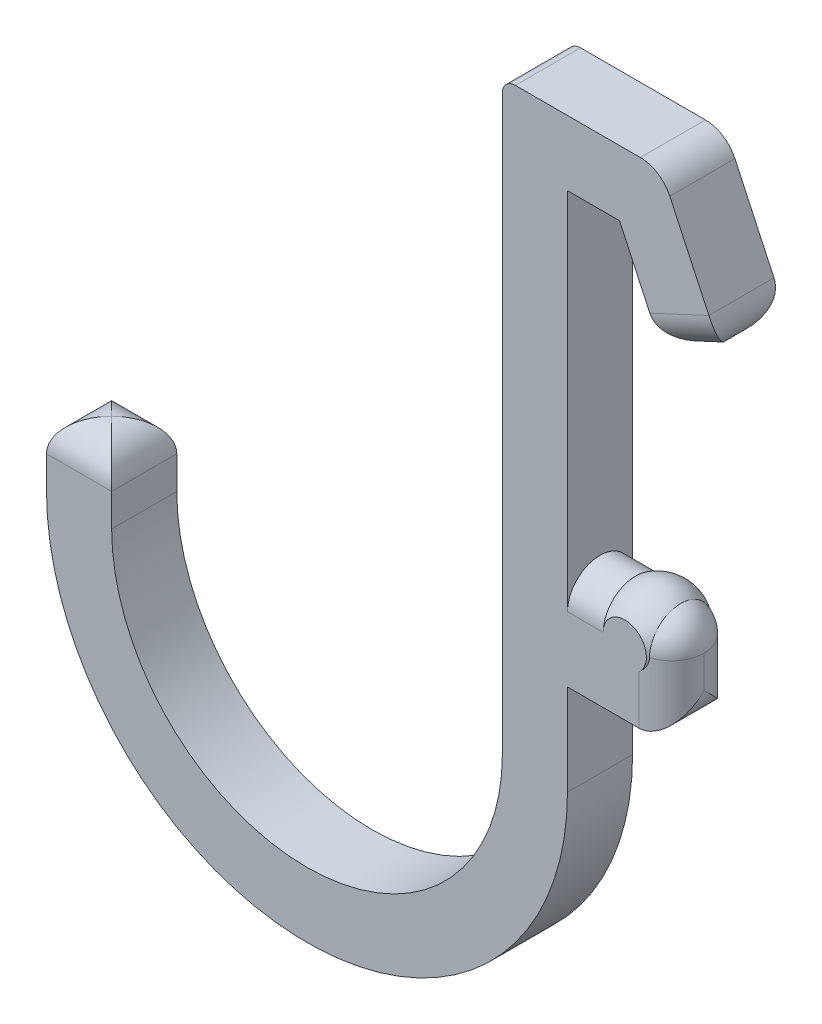
ISO-10303-21;
HEADER;
FILE_DESCRIPTION(('STEP AP214'),'2;1');
FILE_NAME('part.step','',(''),(''),'','','');
FILE_SCHEMA(('AUTOMOTIVE_DESIGN { 1 0 10303 214 1 1 1 1 }'));
ENDSEC;
DATA;
#1=APPLICATION_CONTEXT('core data for automotive mechanical design processes');
#2=APPLICATION_PROTOCOL_DEFINITION('international standard','automotive_design',2000,#1);
#3=PRODUCT_CONTEXT('',#1,'mechanical');
#4=PRODUCT('Part','Part','',(#3));
#5=PRODUCT_RELATED_PRODUCT_CATEGORY('part','',(#4));
#6=PRODUCT_DEFINITION_FORMATION('','',#4);
#7=PRODUCT_DEFINITION_CONTEXT('part definition',#1,'design');
#8=PRODUCT_DEFINITION('design','',#6,#7);
#9=PRODUCT_DEFINITION_SHAPE('','',#8);
#10=(LENGTH_UNIT() NAMED_UNIT(*) SI_UNIT(.MILLI.,.METRE.));
#11=(NAMED_UNIT(*) PLANE_ANGLE_UNIT() SI_UNIT($,.RADIAN.));
#12=(NAMED_UNIT(*) SI_UNIT($,.STERADIAN.) SOLID_ANGLE_UNIT());
#13=UNCERTAINTY_MEASURE_WITH_UNIT(LENGTH_MEASURE(1.E-05),#10,'distance_accuracy_value','');
#14=(GEOMETRIC_REPRESENTATION_CONTEXT(3) GLOBAL_UNCERTAINTY_ASSIGNED_CONTEXT((#13)) GLOBAL_UNIT_ASSIGNED_CONTEXT((#10,
#11,#12)) REPRESENTATION_CONTEXT('',''));
#15=CARTESIAN_POINT('',(0.,0.,0.));
#16=DIRECTION('',(0.,0.,1.));
#17=DIRECTION('',(1.,0.,0.));
#18=AXIS2_PLACEMENT_3D('',#15,#16,#17);
#19=CARTESIAN_POINT('',(13.5901699437495,0.,2.5));
#20=DIRECTION('',(-1.,0.,0.));
#21=DIRECTION('',(0.,0.,1.));
#22=AXIS2_PLACEMENT_3D('',#19,#20,#21);
#23=CYLINDRICAL_SURFACE('',#22,2.5);
#24=CARTESIAN_POINT('',(2.7416876048223,0.,2.5));
#25=DIRECTION('',(1.,0.,0.));
#26=DIRECTION('',(0.,0.,-1.));
#27=AXIS2_PLACEMENT_3D('',#24,#25,#26);
#28=CIRCLE('',#27,2.5);
#29=CARTESIAN_POINT('',(2.7416876048223,0.,0.));
#30=VERTEX_POINT('',#29);
#31=CARTESIAN_POINT('',(2.7416876048223,0.,5.));
#32=VERTEX_POINT('',#31);
#33=EDGE_CURVE('E238',#30,#32,#28,.T.);
#34=ORIENTED_EDGE('',*,*,#33,.F.);
#35=DIRECTION('',(-1.,0.,0.));
#36=VECTOR('',#35,1.);
#37=CARTESIAN_POINT('',(0.,0.,0.));
#38=LINE('',#37,#36);
#39=CARTESIAN_POINT('',(0.,0.,0.));
#40=VERTEX_POINT('',#39);
#41=EDGE_CURVE('E325',#30,#40,#38,.T.);
#42=ORIENTED_EDGE('',*,*,#41,.T.);
#43=CARTESIAN_POINT('',(0.,0.,2.5));
#44=DIRECTION('',(1.,0.,0.));
#45=DIRECTION('',(0.,0.,-1.));
#46=AXIS2_PLACEMENT_3D('',#43,#44,#45);
#47=CIRCLE('',#46,2.5);
#48=CARTESIAN_POINT('',(0.,0.,5.));
#49=VERTEX_POINT('',#48);
#50=EDGE_CURVE('E249',#40,#49,#47,.T.);
#51=ORIENTED_EDGE('',*,*,#50,.T.);
#52=DIRECTION('',(-1.,0.,0.));
#53=VECTOR('',#52,1.);
#54=CARTESIAN_POINT('',(0.,0.,5.));
#55=LINE('',#54,#53);
#56=EDGE_CURVE('E286',#32,#49,#55,.T.);
#57=ORIENTED_EDGE('',*,*,#56,.F.);
#58=EDGE_LOOP('',(#34,#42,#51,#57));
#59=FACE_BOUND('',#58,.T.);
#60=ADVANCED_FACE('F39',(#59),#23,.T.);
#61=CARTESIAN_POINT('',(5.5,0.,2.5));
#62=DIRECTION('',(0.,1.,0.));
#63=DIRECTION('',(0.,0.,1.));
#64=AXIS2_PLACEMENT_3D('',#61,#62,#63);
#65=CYLINDRICAL_SURFACE('',#64,2.5);
#66=DIRECTION('',(0.,1.,0.));
#67=VECTOR('',#66,1.);
#68=CARTESIAN_POINT('',(5.5,-12.,0.));
#69=LINE('',#68,#67);
#70=CARTESIAN_POINT('',(5.5,-1.24096736459909,0.));
#71=VERTEX_POINT('',#70);
#72=CARTESIAN_POINT('',(5.5,-5.,0.));
#73=VERTEX_POINT('',#72);
#74=EDGE_CURVE('E58',#71,#73,#69,.F.);
#75=ORIENTED_EDGE('',*,*,#74,.F.);
#76=CARTESIAN_POINT('',(5.4998,-1.24114463299005,8.00000016901504E-09));
#77=CARTESIAN_POINT('',(5.5363929673262,-1.2087029649529,-9.26164938524013E-06));
#78=CARTESIAN_POINT('',(5.57236876038989,-1.17555626849876,0.00079770122016531));
#79=CARTESIAN_POINT('',(5.6428030561148,-1.10769667819631,0.00383433659862395));
#80=CARTESIAN_POINT('',(5.67726031215857,-1.07298254322827,0.0060651555671746));
#81=CARTESIAN_POINT('',(5.74519128912905,-1.00095424317269,0.0118132669352872));
#82=CARTESIAN_POINT('',(5.77861573042543,-0.963595826296857,0.0153626740978217));
#83=CARTESIAN_POINT('',(5.84305795009588,-0.886981329738944,0.0234356736079334));
#84=CARTESIAN_POINT('',(5.8740762229525,-0.847725642663384,0.0279590650703918));
#85=CARTESIAN_POINT('',(5.96325201148396,-0.726269508254624,0.042561851108955));
#86=CARTESIAN_POINT('',(6.01705538420124,-0.640865596374251,0.0536260746175859));
#87=CARTESIAN_POINT('',(6.10655009460944,-0.461922147892546,0.074258393974845));
#88=CARTESIAN_POINT('',(6.14249859084772,-0.368522297372846,0.0838462716282918));
#89=CARTESIAN_POINT('',(6.17730370336194,-0.227795718404401,0.0934686773099391));
#90=CARTESIAN_POINT('',(6.18570287472368,-0.1829602446012,0.0958641595546958));
#91=CARTESIAN_POINT('',(6.19710907659667,-0.0920455434275466,0.0991560697495525));
#92=CARTESIAN_POINT('',(6.20005395659277,-0.0459579806521387,0.100035211650277));
#93=CARTESIAN_POINT('',(6.19999998181818,0.000200000000000188,0.0999999946969703));
#94=B_SPLINE_CURVE_WITH_KNOTS('',3,(#76,#77,#78,#79,#80,#81,#82,#83,#84,#85,#86,#87,#88,#89,#90,
#91,#92,#93),.UNSPECIFIED.,.F.,.F.,(4,2,2,2,2,2,2,2,4),(0.,0.146701218214616,0.29352070649968,
0.444179394748281,0.594807039223552,0.898088830284032,1.196865790681,1.3335683412279,
1.47181922641049),.UNSPECIFIED.);
#95=CARTESIAN_POINT('',(6.2,0.,0.100000000000001));
#96=VERTEX_POINT('',#95);
#97=EDGE_CURVE('E271',#71,#96,#94,.T.);
#98=ORIENTED_EDGE('',*,*,#97,.T.);
#99=CARTESIAN_POINT('',(5.5,0.,2.5));
#100=DIRECTION('',(0.,1.,0.));
#101=DIRECTION('',(0.,0.,1.));
#102=AXIS2_PLACEMENT_3D('',#99,#100,#101);
#103=CIRCLE('',#102,2.5);
#104=CARTESIAN_POINT('',(8.,0.,2.5));
#105=VERTEX_POINT('',#104);
#106=EDGE_CURVE('E81',#105,#96,#103,.T.);
#107=ORIENTED_EDGE('',*,*,#106,.F.);
#108=DIRECTION('',(0.,1.,0.));
#109=VECTOR('',#108,1.);
#110=CARTESIAN_POINT('',(8.,0.,2.5));
#111=LINE('',#110,#109);
#112=CARTESIAN_POINT('',(8.,-2.5,2.5));
#113=VERTEX_POINT('',#112);
#114=EDGE_CURVE('E242',#113,#105,#111,.T.);
#115=ORIENTED_EDGE('',*,*,#114,.F.);
#116=CARTESIAN_POINT('',(5.5,-2.5,2.5));
#117=DIRECTION('',(0.,0.707106781186547,-0.707106781186547));
#118=DIRECTION('',(0.,-0.707106781186547,-0.707106781186547));
#119=AXIS2_PLACEMENT_3D('',#116,#117,#118);
#120=ELLIPSE('',#119,3.53553390593274,2.5);
#121=EDGE_CURVE('E71',#73,#113,#120,.F.);
#122=ORIENTED_EDGE('',*,*,#121,.F.);
#123=EDGE_LOOP('',(#75,#98,#107,#115,#122));
#124=FACE_BOUND('',#123,.T.);
#125=ADVANCED_FACE('F41',(#124),#65,.T.);
#126=CARTESIAN_POINT('',(5.5,0.,2.5));
#127=DIRECTION('',(-1.,0.,0.));
#128=DIRECTION('',(0.,0.,1.));
#129=AXIS2_PLACEMENT_3D('',#126,#127,#128);
#130=SPHERICAL_SURFACE('',#129,2.5);
#131=ORIENTED_EDGE('',*,*,#106,.T.);
#132=CARTESIAN_POINT('',(6.2,0.,2.5));
#133=DIRECTION('',(-1.,0.,0.));
#134=DIRECTION('',(0.,0.,1.));
#135=AXIS2_PLACEMENT_3D('',#132,#133,#134);
#136=CIRCLE('',#135,2.4);
#137=CARTESIAN_POINT('',(6.2,0.,4.9));
#138=VERTEX_POINT('',#137);
#139=EDGE_CURVE('E279',#96,#138,#136,.F.);
#140=ORIENTED_EDGE('',*,*,#139,.T.);
#141=CARTESIAN_POINT('',(5.5,0.,2.5));
#142=DIRECTION('',(0.,-1.,0.));
#143=DIRECTION('',(0.,0.,-1.));
#144=AXIS2_PLACEMENT_3D('',#141,#142,#143);
#145=CIRCLE('',#144,2.5);
#146=EDGE_CURVE('E233',#105,#138,#145,.T.);
#147=ORIENTED_EDGE('',*,*,#146,.F.);
#148=EDGE_LOOP('',(#131,#140,#147));
#149=FACE_BOUND('',#148,.T.);
#150=ADVANCED_FACE('F513',(#149),#130,.T.);
#151=CARTESIAN_POINT('',(5.5,-12.,2.5));
#152=DIRECTION('',(0.,-1.,0.));
#153=DIRECTION('',(0.,0.,-1.));
#154=AXIS2_PLACEMENT_3D('',#151,#152,#153);
#155=CYLINDRICAL_SURFACE('',#154,2.5);
#156=ORIENTED_EDGE('',*,*,#146,.T.);
#157=CARTESIAN_POINT('',(6.19999998181818,0.0002,4.90000000530303));
#158=CARTESIAN_POINT('',(6.20002060593483,-0.0340215820751626,4.89998817316831));
#159=CARTESIAN_POINT('',(6.1984143593459,-0.0682209096207423,4.90046286433432));
#160=CARTESIAN_POINT('',(6.19208379810463,-0.136249463080852,4.90229830533756));
#161=CARTESIAN_POINT('',(6.18736474729119,-0.170079215952131,4.90365755930238));
#162=CARTESIAN_POINT('',(6.1689482938362,-0.269536910764676,4.90887369332737));
#163=CARTESIAN_POINT('',(6.15098131886339,-0.334336983187606,4.91387497360715));
#164=CARTESIAN_POINT('',(6.09808868579219,-0.48085117024676,4.92759913373652));
#165=CARTESIAN_POINT('',(6.05953499991633,-0.561148858343043,4.9370045157109));
#166=CARTESIAN_POINT('',(5.97007827325949,-0.715449277029459,4.9558368542023));
#167=CARTESIAN_POINT('',(5.91904380010561,-0.789372868652355,4.96526290588241));
#168=CARTESIAN_POINT('',(5.80922506209963,-0.929818254648965,4.98141526656959));
#169=CARTESIAN_POINT('',(5.75055545651681,-0.996426935956446,4.98817650123594));
#170=CARTESIAN_POINT('',(5.65870838300495,-1.09170672728009,4.99514321976577));
#171=CARTESIAN_POINT('',(5.62774086496115,-1.12244386881611,4.99693401300135));
#172=CARTESIAN_POINT('',(5.56461568283012,-1.1826876244331,4.99936451304459));
#173=CARTESIAN_POINT('',(5.53245860969331,-1.21219483443042,5.00000478377816));
#174=CARTESIAN_POINT('',(5.4998,-1.24114463299005,4.999999992));
#175=B_SPLINE_CURVE_WITH_KNOTS('',3,(#157,#158,#159,#160,#161,#162,#163,#164,#165,#166,#167,
#168,#169,#170,#171,#172,#173,#174),.UNSPECIFIED.,.F.,.F.,(4,2,2,2,2,2,2,2,4),(0.,
0.102583403755103,0.204993779301412,0.406260766109182,0.673486519863847,0.943657669752399,
1.21015973265302,1.34112701736425,1.47203009124063),.UNSPECIFIED.);
#176=CARTESIAN_POINT('',(5.5,-1.24096736459909,5.));
#177=VERTEX_POINT('',#176);
#178=EDGE_CURVE('E232',#138,#177,#175,.T.);
#179=ORIENTED_EDGE('',*,*,#178,.T.);
#180=DIRECTION('',(0.,1.,0.));
#181=VECTOR('',#180,1.);
#182=CARTESIAN_POINT('',(5.5,0.,5.));
#183=LINE('',#182,#181);
#184=CARTESIAN_POINT('',(5.5,-5.,5.));
#185=VERTEX_POINT('',#184);
#186=EDGE_CURVE('E221',#185,#177,#183,.T.);
#187=ORIENTED_EDGE('',*,*,#186,.F.);
#188=CARTESIAN_POINT('',(5.5,-2.5,2.5));
#189=DIRECTION('',(0.,-0.707106781186547,-0.707106781186547));
#190=DIRECTION('',(0.,0.707106781186547,-0.707106781186547));
#191=AXIS2_PLACEMENT_3D('',#188,#189,#190);
#192=ELLIPSE('',#191,3.53553390593274,2.5);
#193=EDGE_CURVE('E237',#185,#113,#192,.F.);
#194=ORIENTED_EDGE('',*,*,#193,.T.);
#195=ORIENTED_EDGE('',*,*,#114,.T.);
#196=EDGE_LOOP('',(#156,#179,#187,#194,#195));
#197=FACE_BOUND('',#196,.T.);
#198=ADVANCED_FACE('F258',(#197),#155,.T.);
#199=CARTESIAN_POINT('',(0.,0.,5.));
#200=DIRECTION('',(-1.,0.,0.));
#201=DIRECTION('',(0.,0.,1.));
#202=AXIS2_PLACEMENT_3D('',#199,#200,#201);
#203=PLANE('',#202);
#204=ORIENTED_EDGE('',*,*,#50,.F.);
#205=DIRECTION('',(0.,1.,0.));
#206=VECTOR('',#205,1.);
#207=CARTESIAN_POINT('',(0.,0.,0.));
#208=LINE('',#207,#206);
#209=CARTESIAN_POINT('',(0.,28.,0.));
#210=VERTEX_POINT('',#209);
#211=EDGE_CURVE('E328',#40,#210,#208,.T.);
#212=ORIENTED_EDGE('',*,*,#211,.T.);
#213=DIRECTION('',(0.,0.,-1.));
#214=VECTOR('',#213,1.);
#215=CARTESIAN_POINT('',(0.,28.,5.));
#216=LINE('',#215,#214);
#217=CARTESIAN_POINT('',(0.,28.,5.));
#218=VERTEX_POINT('',#217);
#219=EDGE_CURVE('E389',#218,#210,#216,.T.);
#220=ORIENTED_EDGE('',*,*,#219,.F.);
#221=DIRECTION('',(0.,1.,0.));
#222=VECTOR('',#221,1.);
#223=CARTESIAN_POINT('',(0.,0.,5.));
#224=LINE('',#223,#222);
#225=EDGE_CURVE('E289',#49,#218,#224,.T.);
#226=ORIENTED_EDGE('',*,*,#225,.F.);
#227=EDGE_LOOP('',(#204,#212,#220,#226));
#228=FACE_BOUND('',#227,.T.);
#229=ADVANCED_FACE('F525',(#228),#203,.F.);
#230=CARTESIAN_POINT('',(0.,28.,5.));
#231=DIRECTION('',(0.,1.,0.));
#232=DIRECTION('',(0.,0.,1.));
#233=AXIS2_PLACEMENT_3D('',#230,#231,#232);
#234=PLANE('',#233);
#235=DIRECTION('',(1.,0.,0.));
#236=VECTOR('',#235,1.);
#237=CARTESIAN_POINT('',(0.,28.,0.));
#238=LINE('',#237,#236);
#239=CARTESIAN_POINT('',(4.,28.,0.));
#240=VERTEX_POINT('',#239);
#241=EDGE_CURVE('E332',#210,#240,#238,.T.);
#242=ORIENTED_EDGE('',*,*,#241,.T.);
#243=DIRECTION('',(0.,0.,-1.));
#244=VECTOR('',#243,1.);
#245=CARTESIAN_POINT('',(4.,28.,5.));
#246=LINE('',#245,#244);
#247=CARTESIAN_POINT('',(4.,28.,5.));
#248=VERTEX_POINT('',#247);
#249=EDGE_CURVE('E385',#248,#240,#246,.T.);
#250=ORIENTED_EDGE('',*,*,#249,.F.);
#251=DIRECTION('',(1.,0.,0.));
#252=VECTOR('',#251,1.);
#253=CARTESIAN_POINT('',(0.,28.,5.));
#254=LINE('',#253,#252);
#255=EDGE_CURVE('E293',#218,#248,#254,.T.);
#256=ORIENTED_EDGE('',*,*,#255,.F.);
#257=ORIENTED_EDGE('',*,*,#219,.T.);
#258=EDGE_LOOP('',(#242,#250,#256,#257));
#259=FACE_BOUND('',#258,.T.);
#260=ADVANCED_FACE('F530',(#259),#234,.F.);
#261=CARTESIAN_POINT('',(4.,28.,5.));
#262=DIRECTION('',(0.906307787036651,0.422618261740697,0.));
#263=DIRECTION('',(-0.422618261740697,0.906307787036651,0.));
#264=AXIS2_PLACEMENT_3D('',#261,#262,#263);
#265=PLANE('',#264);
#266=DIRECTION('',(0.422618261740697,-0.906307787036651,0.));
#267=VECTOR('',#266,1.);
#268=CARTESIAN_POINT('',(4.,28.,0.));
#269=LINE('',#268,#267);
#270=CARTESIAN_POINT('',(6.32440043957384,23.0153071712984,0.));
#271=VERTEX_POINT('',#270);
#272=EDGE_CURVE('E335',#240,#271,#269,.T.);
#273=ORIENTED_EDGE('',*,*,#272,.T.);
#274=DIRECTION('',(0.,0.,-1.));
#275=VECTOR('',#274,1.);
#276=CARTESIAN_POINT('',(6.32440043957383,23.0153071712984,5.));
#277=LINE('',#276,#275);
#278=CARTESIAN_POINT('',(6.32440043957383,23.0153071712984,5.));
#279=VERTEX_POINT('',#278);
#280=EDGE_CURVE('E393',#271,#279,#277,.F.);
#281=ORIENTED_EDGE('',*,*,#280,.T.);
#282=DIRECTION('',(0.422618261740697,-0.906307787036651,0.));
#283=VECTOR('',#282,1.);
#284=CARTESIAN_POINT('',(4.,28.,5.));
#285=LINE('',#284,#283);
#286=EDGE_CURVE('E296',#248,#279,#285,.T.);
#287=ORIENTED_EDGE('',*,*,#286,.F.);
#288=ORIENTED_EDGE('',*,*,#249,.T.);
#289=EDGE_LOOP('',(#273,#281,#287,#288));
#290=FACE_BOUND('',#289,.T.);
#291=ADVANCED_FACE('F532',(#290),#265,.F.);
#292=CARTESIAN_POINT('',(11.9124850291088,22.8626290124103,5.));
#293=DIRECTION('',(-0.906307787036651,-0.422618261740697,0.));
#294=DIRECTION('',(0.422618261740697,-0.906307787036651,0.));
#295=AXIS2_PLACEMENT_3D('',#292,#293,#294);
#296=PLANE('',#295);
#297=DIRECTION('',(-0.422618261740697,0.906307787036651,0.));
#298=VECTOR('',#297,1.);
#299=CARTESIAN_POINT('',(11.9124850291088,22.8626290124103,5.));
#300=LINE('',#299,#298);
#301=CARTESIAN_POINT('',(10.8559393747571,25.1283984800019,5.));
#302=VERTEX_POINT('',#301);
#303=CARTESIAN_POINT('',(7.85844511961037,31.5565456543517,5.));
#304=VERTEX_POINT('',#303);
#305=EDGE_CURVE('E214',#302,#304,#300,.T.);
#306=ORIENTED_EDGE('',*,*,#305,.F.);
#307=DIRECTION('',(0.,0.,-1.));
#308=VECTOR('',#307,1.);
#309=CARTESIAN_POINT('',(10.8559393747571,25.1283984800019,5.));
#310=LINE('',#309,#308);
#311=CARTESIAN_POINT('',(10.8559393747571,25.1283984800019,0.));
#312=VERTEX_POINT('',#311);
#313=EDGE_CURVE('E408',#302,#312,#310,.T.);
#314=ORIENTED_EDGE('',*,*,#313,.T.);
#315=DIRECTION('',(-0.422618261740697,0.906307787036651,0.));
#316=VECTOR('',#315,1.);
#317=CARTESIAN_POINT('',(11.9124850291088,22.8626290124103,0.));
#318=LINE('',#317,#316);
#319=CARTESIAN_POINT('',(7.85844511961037,31.5565456543517,0.));
#320=VERTEX_POINT('',#319);
#321=EDGE_CURVE('E339',#312,#320,#318,.T.);
#322=ORIENTED_EDGE('',*,*,#321,.T.);
#323=DIRECTION('',(0.,0.,-1.));
#324=VECTOR('',#323,1.);
#325=CARTESIAN_POINT('',(7.85844511961037,31.5565456543517,5.));
#326=LINE('',#325,#324);
#327=EDGE_CURVE('E405',#320,#304,#326,.F.);
#328=ORIENTED_EDGE('',*,*,#327,.T.);
#329=EDGE_LOOP('',(#306,#314,#322,#328));
#330=FACE_BOUND('',#329,.T.);
#331=ADVANCED_FACE('F546',(#330),#296,.F.);
#332=CARTESIAN_POINT('',(-5.,33.,5.));
#333=DIRECTION('',(0.,-1.,0.));
#334=DIRECTION('',(0.,0.,-1.));
#335=AXIS2_PLACEMENT_3D('',#332,#333,#334);
#336=PLANE('',#335);
#337=DIRECTION('',(-1.,0.,0.));
#338=VECTOR('',#337,1.);
#339=CARTESIAN_POINT('',(-5.,33.,0.));
#340=LINE('',#339,#338);
#341=CARTESIAN_POINT('',(5.59267565201873,33.,0.));
#342=VERTEX_POINT('',#341);
#343=CARTESIAN_POINT('',(-4.,33.,0.));
#344=VERTEX_POINT('',#343);
#345=EDGE_CURVE('E200',#342,#344,#340,.T.);
#346=ORIENTED_EDGE('',*,*,#345,.T.);
#347=DIRECTION('',(0.,0.,-1.));
#348=VECTOR('',#347,1.);
#349=CARTESIAN_POINT('',(-4.,33.,5.));
#350=LINE('',#349,#348);
#351=CARTESIAN_POINT('',(-4.,33.,5.));
#352=VERTEX_POINT('',#351);
#353=EDGE_CURVE('E193',#344,#352,#350,.F.);
#354=ORIENTED_EDGE('',*,*,#353,.T.);
#355=DIRECTION('',(-1.,0.,0.));
#356=VECTOR('',#355,1.);
#357=CARTESIAN_POINT('',(-5.,33.,5.));
#358=LINE('',#357,#356);
#359=CARTESIAN_POINT('',(5.59267565201873,33.,5.));
#360=VERTEX_POINT('',#359);
#361=EDGE_CURVE('E197',#360,#352,#358,.T.);
#362=ORIENTED_EDGE('',*,*,#361,.F.);
#363=DIRECTION('',(0.,0.,-1.));
#364=VECTOR('',#363,1.);
#365=CARTESIAN_POINT('',(5.59267565201874,33.,5.));
#366=LINE('',#365,#364);
#367=EDGE_CURVE('E427',#360,#342,#366,.T.);
#368=ORIENTED_EDGE('',*,*,#367,.T.);
#369=EDGE_LOOP('',(#346,#354,#362,#368));
#370=FACE_BOUND('',#369,.T.);
#371=ADVANCED_FACE('F195',(#370),#336,.F.);
#372=CARTESIAN_POINT('',(-5.,33.,5.));
#373=DIRECTION('',(1.,0.,0.));
#374=DIRECTION('',(0.,1.,0.));
#375=AXIS2_PLACEMENT_3D('',#372,#373,#374);
#376=PLANE('',#375);
#377=DIRECTION('',(0.,-1.,0.));
#378=VECTOR('',#377,1.);
#379=CARTESIAN_POINT('',(-5.,33.,5.));
#380=LINE('',#379,#378);
#381=CARTESIAN_POINT('',(-5.,32.,5.));
#382=VERTEX_POINT('',#381);
#383=CARTESIAN_POINT('',(-4.99999999999999,-12.,5.));
#384=VERTEX_POINT('',#383);
#385=EDGE_CURVE('E213',#382,#384,#380,.T.);
#386=ORIENTED_EDGE('',*,*,#385,.F.);
#387=DIRECTION('',(0.,0.,-1.));
#388=VECTOR('',#387,1.);
#389=CARTESIAN_POINT('',(-5.,32.,5.));
#390=LINE('',#389,#388);
#391=CARTESIAN_POINT('',(-5.,32.,0.));
#392=VERTEX_POINT('',#391);
#393=EDGE_CURVE('E219',#382,#392,#390,.T.);
#394=ORIENTED_EDGE('',*,*,#393,.T.);
#395=DIRECTION('',(0.,-1.,0.));
#396=VECTOR('',#395,1.);
#397=CARTESIAN_POINT('',(-5.,33.,0.));
#398=LINE('',#397,#396);
#399=CARTESIAN_POINT('',(-4.99999999999999,-12.,0.));
#400=VERTEX_POINT('',#399);
#401=EDGE_CURVE('E345',#392,#400,#398,.T.);
#402=ORIENTED_EDGE('',*,*,#401,.T.);
#403=DIRECTION('',(0.,0.,-1.));
#404=VECTOR('',#403,1.);
#405=CARTESIAN_POINT('',(-4.99999999999999,-12.,5.));
#406=LINE('',#405,#404);
#407=EDGE_CURVE('E381',#384,#400,#406,.T.);
#408=ORIENTED_EDGE('',*,*,#407,.F.);
#409=EDGE_LOOP('',(#386,#394,#402,#408));
#410=FACE_BOUND('',#409,.T.);
#411=ADVANCED_FACE('F465',(#410),#376,.F.);
#412=CARTESIAN_POINT('',(-20.,-12.,5.));
#413=DIRECTION('',(0.,0.,-1.));
#414=DIRECTION('',(-1.,0.,0.));
#415=AXIS2_PLACEMENT_3D('',#412,#413,#414);
#416=CYLINDRICAL_SURFACE('',#415,15.);
#417=CARTESIAN_POINT('',(-20.,-12.,0.));
#418=DIRECTION('',(0.,0.,-1.));
#419=DIRECTION('',(1.,0.,0.));
#420=AXIS2_PLACEMENT_3D('',#417,#418,#419);
#421=CIRCLE('',#420,15.);
#422=CARTESIAN_POINT('',(-35.,-12.,0.));
#423=VERTEX_POINT('',#422);
#424=EDGE_CURVE('E348',#400,#423,#421,.T.);
#425=ORIENTED_EDGE('',*,*,#424,.T.);
#426=DIRECTION('',(0.,0.,-1.));
#427=VECTOR('',#426,1.);
#428=CARTESIAN_POINT('',(-35.,-12.,5.));
#429=LINE('',#428,#427);
#430=CARTESIAN_POINT('',(-35.,-12.,5.));
#431=VERTEX_POINT('',#430);
#432=EDGE_CURVE('E377',#431,#423,#429,.T.);
#433=ORIENTED_EDGE('',*,*,#432,.F.);
#434=CARTESIAN_POINT('',(-20.,-12.,5.));
#435=DIRECTION('',(0.,0.,-1.));
#436=DIRECTION('',(1.,0.,0.));
#437=AXIS2_PLACEMENT_3D('',#434,#435,#436);
#438=CIRCLE('',#437,15.);
#439=EDGE_CURVE('E304',#384,#431,#438,.T.);
#440=ORIENTED_EDGE('',*,*,#439,.F.);
#441=ORIENTED_EDGE('',*,*,#407,.T.);
#442=EDGE_LOOP('',(#425,#433,#440,#441));
#443=FACE_BOUND('',#442,.T.);
#444=ADVANCED_FACE('F471',(#443),#416,.F.);
#445=CARTESIAN_POINT('',(-35.,-12.,5.));
#446=DIRECTION('',(-1.,0.,0.));
#447=DIRECTION('',(0.,-1.,0.));
#448=AXIS2_PLACEMENT_3D('',#445,#446,#447);
#449=PLANE('',#448);
#450=DIRECTION('',(0.,1.,0.));
#451=VECTOR('',#450,1.);
#452=CARTESIAN_POINT('',(-35.,-12.,0.));
#453=LINE('',#452,#451);
#454=CARTESIAN_POINT('',(-35.,-9.49999999999999,0.));
#455=VERTEX_POINT('',#454);
#456=EDGE_CURVE('E351',#423,#455,#453,.T.);
#457=ORIENTED_EDGE('',*,*,#456,.T.);
#458=DIRECTION('',(0.,0.,-1.));
#459=VECTOR('',#458,1.);
#460=CARTESIAN_POINT('',(-35.,-9.49999999999999,5.));
#461=LINE('',#460,#459);
#462=CARTESIAN_POINT('',(-35.,-9.49999999999999,5.));
#463=VERTEX_POINT('',#462);
#464=EDGE_CURVE('E420',#455,#463,#461,.F.);
#465=ORIENTED_EDGE('',*,*,#464,.T.);
#466=DIRECTION('',(0.,1.,0.));
#467=VECTOR('',#466,1.);
#468=CARTESIAN_POINT('',(-35.,-12.,5.));
#469=LINE('',#468,#467);
#470=EDGE_CURVE('E307',#431,#463,#469,.T.);
#471=ORIENTED_EDGE('',*,*,#470,.F.);
#472=ORIENTED_EDGE('',*,*,#432,.T.);
#473=EDGE_LOOP('',(#457,#465,#471,#472));
#474=FACE_BOUND('',#473,.T.);
#475=ADVANCED_FACE('F474',(#474),#449,.F.);
#476=CARTESIAN_POINT('',(-40.,-6.99999999999999,5.));
#477=DIRECTION('',(1.,0.,0.));
#478=DIRECTION('',(0.,1.,0.));
#479=AXIS2_PLACEMENT_3D('',#476,#477,#478);
#480=PLANE('',#479);
#481=DIRECTION('',(0.,-1.,0.));
#482=VECTOR('',#481,1.);
#483=CARTESIAN_POINT('',(-40.,-6.99999999999999,5.));
#484=LINE('',#483,#482);
#485=CARTESIAN_POINT('',(-40.,-9.49999999999999,5.));
#486=VERTEX_POINT('',#485);
#487=CARTESIAN_POINT('',(-40.,-12.,5.));
#488=VERTEX_POINT('',#487);
#489=EDGE_CURVE('E311',#486,#488,#484,.T.);
#490=ORIENTED_EDGE('',*,*,#489,.F.);
#491=DIRECTION('',(0.,0.,-1.));
#492=VECTOR('',#491,1.);
#493=CARTESIAN_POINT('',(-40.,-9.49999999999999,5.));
#494=LINE('',#493,#492);
#495=CARTESIAN_POINT('',(-40.,-9.49999999999999,0.));
#496=VERTEX_POINT('',#495);
#497=EDGE_CURVE('E424',#486,#496,#494,.T.);
#498=ORIENTED_EDGE('',*,*,#497,.T.);
#499=DIRECTION('',(0.,-1.,0.));
#500=VECTOR('',#499,1.);
#501=CARTESIAN_POINT('',(-40.,-6.99999999999999,0.));
#502=LINE('',#501,#500);
#503=CARTESIAN_POINT('',(-40.,-12.,0.));
#504=VERTEX_POINT('',#503);
#505=EDGE_CURVE('E355',#496,#504,#502,.T.);
#506=ORIENTED_EDGE('',*,*,#505,.T.);
#507=DIRECTION('',(0.,0.,-1.));
#508=VECTOR('',#507,1.);
#509=CARTESIAN_POINT('',(-40.,-12.,5.));
#510=LINE('',#509,#508);
#511=EDGE_CURVE('E373',#488,#504,#510,.T.);
#512=ORIENTED_EDGE('',*,*,#511,.F.);
#513=EDGE_LOOP('',(#490,#498,#506,#512));
#514=FACE_BOUND('',#513,.T.);
#515=ADVANCED_FACE('F492',(#514),#480,.F.);
#516=CARTESIAN_POINT('',(-20.,-12.,5.));
#517=DIRECTION('',(0.,0.,-1.));
#518=DIRECTION('',(-1.,0.,0.));
#519=AXIS2_PLACEMENT_3D('',#516,#517,#518);
#520=CYLINDRICAL_SURFACE('',#519,20.);
#521=CARTESIAN_POINT('',(-20.,-12.,0.));
#522=DIRECTION('',(0.,0.,1.));
#523=DIRECTION('',(1.,0.,0.));
#524=AXIS2_PLACEMENT_3D('',#521,#522,#523);
#525=CIRCLE('',#524,20.);
#526=CARTESIAN_POINT('',(0.,-12.,0.));
#527=VERTEX_POINT('',#526);
#528=EDGE_CURVE('E358',#504,#527,#525,.T.);
#529=ORIENTED_EDGE('',*,*,#528,.T.);
#530=DIRECTION('',(0.,0.,-1.));
#531=VECTOR('',#530,1.);
#532=CARTESIAN_POINT('',(0.,-12.,5.));
#533=LINE('',#532,#531);
#534=CARTESIAN_POINT('',(0.,-12.,5.));
#535=VERTEX_POINT('',#534);
#536=EDGE_CURVE('E369',#535,#527,#533,.T.);
#537=ORIENTED_EDGE('',*,*,#536,.F.);
#538=CARTESIAN_POINT('',(-20.,-12.,5.));
#539=DIRECTION('',(0.,0.,1.));
#540=DIRECTION('',(1.,0.,0.));
#541=AXIS2_PLACEMENT_3D('',#538,#539,#540);
#542=CIRCLE('',#541,20.);
#543=EDGE_CURVE('E314',#488,#535,#542,.T.);
#544=ORIENTED_EDGE('',*,*,#543,.F.);
#545=ORIENTED_EDGE('',*,*,#511,.T.);
#546=EDGE_LOOP('',(#529,#537,#544,#545));
#547=FACE_BOUND('',#546,.T.);
#548=ADVANCED_FACE('F684',(#547),#520,.T.);
#549=CARTESIAN_POINT('',(0.,-5.,5.));
#550=DIRECTION('',(-1.,0.,0.));
#551=DIRECTION('',(0.,-1.,0.));
#552=AXIS2_PLACEMENT_3D('',#549,#550,#551);
#553=PLANE('',#552);
#554=DIRECTION('',(0.,1.,0.));
#555=VECTOR('',#554,1.);
#556=CARTESIAN_POINT('',(0.,-5.,0.));
#557=LINE('',#556,#555);
#558=CARTESIAN_POINT('',(0.,-5.,0.));
#559=VERTEX_POINT('',#558);
#560=EDGE_CURVE('E361',#527,#559,#557,.T.);
#561=ORIENTED_EDGE('',*,*,#560,.T.);
#562=DIRECTION('',(0.,0.,-1.));
#563=VECTOR('',#562,1.);
#564=CARTESIAN_POINT('',(0.,-5.,5.));
#565=LINE('',#564,#563);
#566=CARTESIAN_POINT('',(0.,-5.,5.));
#567=VERTEX_POINT('',#566);
#568=EDGE_CURVE('E324',#567,#559,#565,.T.);
#569=ORIENTED_EDGE('',*,*,#568,.F.);
#570=DIRECTION('',(0.,1.,0.));
#571=VECTOR('',#570,1.);
#572=CARTESIAN_POINT('',(0.,-5.,5.));
#573=LINE('',#572,#571);
#574=EDGE_CURVE('E317',#535,#567,#573,.T.);
#575=ORIENTED_EDGE('',*,*,#574,.F.);
#576=ORIENTED_EDGE('',*,*,#536,.T.);
#577=EDGE_LOOP('',(#561,#569,#575,#576));
#578=FACE_BOUND('',#577,.T.);
#579=ADVANCED_FACE('F680',(#578),#553,.F.);
#580=CARTESIAN_POINT('',(8.,-5.,5.));
#581=DIRECTION('',(0.,1.,0.));
#582=DIRECTION('',(0.,0.,1.));
#583=AXIS2_PLACEMENT_3D('',#580,#581,#582);
#584=PLANE('',#583);
#585=DIRECTION('',(1.,0.,0.));
#586=VECTOR('',#585,1.);
#587=CARTESIAN_POINT('',(8.,-5.,0.));
#588=LINE('',#587,#586);
#589=EDGE_CURVE('E290',#559,#73,#588,.T.);
#590=ORIENTED_EDGE('',*,*,#589,.T.);
#591=DIRECTION('',(0.,0.,-1.));
#592=VECTOR('',#591,1.);
#593=CARTESIAN_POINT('',(5.5,-5.,5.));
#594=LINE('',#593,#592);
#595=EDGE_CURVE('E229',#73,#185,#594,.F.);
#596=ORIENTED_EDGE('',*,*,#595,.T.);
#597=DIRECTION('',(1.,0.,0.));
#598=VECTOR('',#597,1.);
#599=CARTESIAN_POINT('',(8.,-5.,5.));
#600=LINE('',#599,#598);
#601=EDGE_CURVE('E320',#567,#185,#600,.T.);
#602=ORIENTED_EDGE('',*,*,#601,.F.);
#603=ORIENTED_EDGE('',*,*,#568,.T.);
#604=EDGE_LOOP('',(#590,#596,#602,#603));
#605=FACE_BOUND('',#604,.T.);
#606=ADVANCED_FACE('F612',(#605),#584,.F.);
#607=CARTESIAN_POINT('',(-20.,-12.,5.));
#608=DIRECTION('',(0.,0.,1.));
#609=DIRECTION('',(1.,0.,0.));
#610=AXIS2_PLACEMENT_3D('',#607,#608,#609);
#611=PLANE('',#610);
#612=ORIENTED_EDGE('',*,*,#186,.T.);
#613=CARTESIAN_POINT('',(4.4,0.,5.));
#614=DIRECTION('',(0.,0.,-1.));
#615=DIRECTION('',(-1.,0.,0.));
#616=AXIS2_PLACEMENT_3D('',#613,#614,#615);
#617=CIRCLE('',#616,1.6583123951777);
#618=EDGE_CURVE('E50',#32,#177,#617,.T.);
#619=ORIENTED_EDGE('',*,*,#618,.F.);
#620=ORIENTED_EDGE('',*,*,#56,.T.);
#621=ORIENTED_EDGE('',*,*,#225,.T.);
#622=ORIENTED_EDGE('',*,*,#255,.T.);
#623=ORIENTED_EDGE('',*,*,#286,.T.);
#624=DIRECTION('',(0.906307787036651,0.422618261740698,0.));
#625=VECTOR('',#624,1.);
#626=CARTESIAN_POINT('',(10.8559393747571,25.1283984800019,5.));
#627=LINE('',#626,#625);
#628=EDGE_CURVE('E402',#279,#302,#627,.T.);
#629=ORIENTED_EDGE('',*,*,#628,.T.);
#630=ORIENTED_EDGE('',*,*,#305,.T.);
#631=CARTESIAN_POINT('',(5.59267565201874,30.5,5.));
#632=DIRECTION('',(0.,0.,1.));
#633=DIRECTION('',(1.,0.,0.));
#634=AXIS2_PLACEMENT_3D('',#631,#632,#633);
#635=CIRCLE('',#634,2.5);
#636=EDGE_CURVE('E211',#304,#360,#635,.T.);
#637=ORIENTED_EDGE('',*,*,#636,.T.);
#638=ORIENTED_EDGE('',*,*,#361,.T.);
#639=CARTESIAN_POINT('',(-4.,32.,5.));
#640=DIRECTION('',(0.,0.,1.));
#641=DIRECTION('',(1.,0.,0.));
#642=AXIS2_PLACEMENT_3D('',#639,#640,#641);
#643=CIRCLE('',#642,1.);
#644=EDGE_CURVE('E204',#352,#382,#643,.T.);
#645=ORIENTED_EDGE('',*,*,#644,.T.);
#646=ORIENTED_EDGE('',*,*,#385,.T.);
#647=ORIENTED_EDGE('',*,*,#439,.T.);
#648=ORIENTED_EDGE('',*,*,#470,.T.);
#649=DIRECTION('',(-1.,0.,0.));
#650=VECTOR('',#649,1.);
#651=CARTESIAN_POINT('',(-40.,-9.49999999999999,5.));
#652=LINE('',#651,#650);
#653=EDGE_CURVE('E399',#463,#486,#652,.T.);
#654=ORIENTED_EDGE('',*,*,#653,.T.);
#655=ORIENTED_EDGE('',*,*,#489,.T.);
#656=ORIENTED_EDGE('',*,*,#543,.T.);
#657=ORIENTED_EDGE('',*,*,#574,.T.);
#658=ORIENTED_EDGE('',*,*,#601,.T.);
#659=EDGE_LOOP('',(#612,#619,#620,#621,#622,#623,#629,#630,#637,#638,#645,#646,#647,#648,#654,
#655,#656,#657,#658));
#660=FACE_BOUND('',#659,.T.);
#661=ADVANCED_FACE('F207',(#660),#611,.T.);
#662=CARTESIAN_POINT('',(-20.,-12.,0.));
#663=DIRECTION('',(0.,0.,1.));
#664=DIRECTION('',(1.,0.,0.));
#665=AXIS2_PLACEMENT_3D('',#662,#663,#664);
#666=PLANE('',#665);
#667=ORIENTED_EDGE('',*,*,#241,.F.);
#668=ORIENTED_EDGE('',*,*,#211,.F.);
#669=ORIENTED_EDGE('',*,*,#41,.F.);
#670=CARTESIAN_POINT('',(4.4,0.,0.));
#671=DIRECTION('',(0.,0.,1.));
#672=DIRECTION('',(1.,0.,0.));
#673=AXIS2_PLACEMENT_3D('',#670,#671,#672);
#674=CIRCLE('',#673,1.6583123951777);
#675=EDGE_CURVE('E11',#71,#30,#674,.T.);
#676=ORIENTED_EDGE('',*,*,#675,.F.);
#677=ORIENTED_EDGE('',*,*,#74,.T.);
#678=ORIENTED_EDGE('',*,*,#589,.F.);
#679=ORIENTED_EDGE('',*,*,#560,.F.);
#680=ORIENTED_EDGE('',*,*,#528,.F.);
#681=ORIENTED_EDGE('',*,*,#505,.F.);
#682=DIRECTION('',(-1.,0.,0.));
#683=VECTOR('',#682,1.);
#684=CARTESIAN_POINT('',(-20.,-9.49999999999999,0.));
#685=LINE('',#684,#683);
#686=EDGE_CURVE('E414',#496,#455,#685,.F.);
#687=ORIENTED_EDGE('',*,*,#686,.T.);
#688=ORIENTED_EDGE('',*,*,#456,.F.);
#689=ORIENTED_EDGE('',*,*,#424,.F.);
#690=ORIENTED_EDGE('',*,*,#401,.F.);
#691=CARTESIAN_POINT('',(-4.,32.,0.));
#692=DIRECTION('',(0.,0.,1.));
#693=DIRECTION('',(1.,0.,0.));
#694=AXIS2_PLACEMENT_3D('',#691,#692,#693);
#695=CIRCLE('',#694,1.);
#696=EDGE_CURVE('E205',#392,#344,#695,.F.);
#697=ORIENTED_EDGE('',*,*,#696,.T.);
#698=ORIENTED_EDGE('',*,*,#345,.F.);
#699=CARTESIAN_POINT('',(5.59267565201874,30.5,0.));
#700=DIRECTION('',(0.,0.,1.));
#701=DIRECTION('',(1.,0.,0.));
#702=AXIS2_PLACEMENT_3D('',#699,#700,#701);
#703=CIRCLE('',#702,2.5);
#704=EDGE_CURVE('E411',#342,#320,#703,.F.);
#705=ORIENTED_EDGE('',*,*,#704,.T.);
#706=ORIENTED_EDGE('',*,*,#321,.F.);
#707=DIRECTION('',(0.906307787036651,0.422618261740698,0.));
#708=VECTOR('',#707,1.);
#709=CARTESIAN_POINT('',(-28.7099397390442,6.67852604760154,0.));
#710=LINE('',#709,#708);
#711=EDGE_CURVE('E417',#312,#271,#710,.F.);
#712=ORIENTED_EDGE('',*,*,#711,.T.);
#713=ORIENTED_EDGE('',*,*,#272,.F.);
#714=EDGE_LOOP('',(#667,#668,#669,#676,#677,#678,#679,#680,#681,#687,#688,#689,#690,#697,#698,
#705,#706,#712,#713));
#715=FACE_BOUND('',#714,.T.);
#716=ADVANCED_FACE('F462',(#715),#666,.F.);
#717=CARTESIAN_POINT('',(8.59016990716546,24.0718528256502,5.));
#718=DIRECTION('',(0.,0.,-1.));
#719=DIRECTION('',(-1.,0.,0.));
#720=AXIS2_PLACEMENT_3D('',#717,#718,#719);
#721=CYLINDRICAL_SURFACE('',#720,2.5);
#722=CARTESIAN_POINT('',(8.59016990716546,24.0718528256502,2.5));
#723=DIRECTION('',(0.640856382055789,0.298836238730119,0.707106781186547));
#724=DIRECTION('',(0.640856382055789,0.298836238730119,-0.707106781186547));
#725=AXIS2_PLACEMENT_3D('',#722,#723,#724);
#726=ELLIPSE('',#725,3.53553390593274,2.5);
#727=CARTESIAN_POINT('',(9.64671556151721,21.8060833580585,2.5));
#728=VERTEX_POINT('',#727);
#729=EDGE_CURVE('E438',#312,#728,#726,.F.);
#730=ORIENTED_EDGE('',*,*,#729,.F.);
#731=ORIENTED_EDGE('',*,*,#313,.F.);
#732=CARTESIAN_POINT('',(8.59016990716546,24.0718528256502,2.5));
#733=DIRECTION('',(0.640856382055789,0.298836238730119,-0.707106781186547));
#734=DIRECTION('',(-0.640856382055789,-0.298836238730119,-0.707106781186547));
#735=AXIS2_PLACEMENT_3D('',#732,#733,#734);
#736=ELLIPSE('',#735,3.53553390593274,2.5);
#737=EDGE_CURVE('E329',#728,#302,#736,.F.);
#738=ORIENTED_EDGE('',*,*,#737,.F.);
#739=EDGE_LOOP('',(#730,#731,#738));
#740=FACE_BOUND('',#739,.T.);
#741=ADVANCED_FACE('F549',(#740),#721,.T.);
#742=CARTESIAN_POINT('',(-28.7099397390442,6.67852604760154,2.5));
#743=DIRECTION('',(-0.906307787036651,-0.422618261740698,0.));
#744=DIRECTION('',(0.422618261740698,-0.906307787036651,0.));
#745=AXIS2_PLACEMENT_3D('',#742,#743,#744);
#746=CYLINDRICAL_SURFACE('',#745,2.5);
#747=ORIENTED_EDGE('',*,*,#737,.T.);
#748=ORIENTED_EDGE('',*,*,#628,.F.);
#749=CARTESIAN_POINT('',(8.59016990716546,24.0718528256502,2.5));
#750=DIRECTION('',(-0.640856382055789,-0.298836238730119,-0.707106781186547));
#751=DIRECTION('',(-0.640856382055789,-0.298836238730119,0.707106781186547));
#752=AXIS2_PLACEMENT_3D('',#749,#750,#751);
#753=ELLIPSE('',#752,3.53553390593274,2.5);
#754=EDGE_CURVE('E434',#728,#279,#753,.T.);
#755=ORIENTED_EDGE('',*,*,#754,.F.);
#756=EDGE_LOOP('',(#747,#748,#755));
#757=FACE_BOUND('',#756,.T.);
#758=ADVANCED_FACE('F543',(#757),#746,.T.);
#759=CARTESIAN_POINT('',(6.32440043957383,23.0153071712984,2.5));
#760=DIRECTION('',(0.906307787036651,0.422618261740698,0.));
#761=DIRECTION('',(-0.422618261740698,0.906307787036651,0.));
#762=AXIS2_PLACEMENT_3D('',#759,#760,#761);
#763=CYLINDRICAL_SURFACE('',#762,2.5);
#764=ORIENTED_EDGE('',*,*,#711,.F.);
#765=ORIENTED_EDGE('',*,*,#729,.T.);
#766=CARTESIAN_POINT('',(8.59016990716546,24.0718528256502,2.5));
#767=DIRECTION('',(0.640856382055789,0.298836238730119,-0.707106781186547));
#768=DIRECTION('',(0.640856382055789,0.298836238730119,0.707106781186547));
#769=AXIS2_PLACEMENT_3D('',#766,#767,#768);
#770=ELLIPSE('',#769,3.53553390593274,2.5);
#771=EDGE_CURVE('E430',#271,#728,#770,.F.);
#772=ORIENTED_EDGE('',*,*,#771,.F.);
#773=EDGE_LOOP('',(#764,#765,#772));
#774=FACE_BOUND('',#773,.T.);
#775=ADVANCED_FACE('F504',(#774),#763,.T.);
#776=CARTESIAN_POINT('',(8.59016990716546,24.0718528256502,5.));
#777=DIRECTION('',(0.,0.,-1.));
#778=DIRECTION('',(-1.,0.,0.));
#779=AXIS2_PLACEMENT_3D('',#776,#777,#778);
#780=CYLINDRICAL_SURFACE('',#779,2.5);
#781=ORIENTED_EDGE('',*,*,#754,.T.);
#782=ORIENTED_EDGE('',*,*,#280,.F.);
#783=ORIENTED_EDGE('',*,*,#771,.T.);
#784=EDGE_LOOP('',(#781,#782,#783));
#785=FACE_BOUND('',#784,.T.);
#786=ADVANCED_FACE('F497',(#785),#780,.T.);
#787=CARTESIAN_POINT('',(-37.5,-9.49999999999999,5.));
#788=DIRECTION('',(0.,0.,-1.));
#789=DIRECTION('',(-1.,0.,0.));
#790=AXIS2_PLACEMENT_3D('',#787,#788,#789);
#791=CYLINDRICAL_SURFACE('',#790,2.5);
#792=CARTESIAN_POINT('',(-37.5,-9.49999999999999,2.5));
#793=DIRECTION('',(-0.707106781186547,0.,0.707106781186547));
#794=DIRECTION('',(-0.707106781186547,0.,-0.707106781186547));
#795=AXIS2_PLACEMENT_3D('',#792,#793,#794);
#796=ELLIPSE('',#795,3.53553390593274,2.5);
#797=CARTESIAN_POINT('',(-37.5,-6.99999999999999,2.5));
#798=VERTEX_POINT('',#797);
#799=EDGE_CURVE('E451',#496,#798,#796,.F.);
#800=ORIENTED_EDGE('',*,*,#799,.F.);
#801=ORIENTED_EDGE('',*,*,#497,.F.);
#802=CARTESIAN_POINT('',(-37.5,-9.49999999999999,2.5));
#803=DIRECTION('',(-0.707106781186547,0.,-0.707106781186547));
#804=DIRECTION('',(0.707106781186547,0.,-0.707106781186547));
#805=AXIS2_PLACEMENT_3D('',#802,#803,#804);
#806=ELLIPSE('',#805,3.53553390593274,2.5);
#807=EDGE_CURVE('E435',#798,#486,#806,.F.);
#808=ORIENTED_EDGE('',*,*,#807,.F.);
#809=EDGE_LOOP('',(#800,#801,#808));
#810=FACE_BOUND('',#809,.T.);
#811=ADVANCED_FACE('F495',(#810),#791,.T.);
#812=CARTESIAN_POINT('',(-20.,-9.49999999999999,2.5));
#813=DIRECTION('',(1.,0.,0.));
#814=DIRECTION('',(0.,1.,0.));
#815=AXIS2_PLACEMENT_3D('',#812,#813,#814);
#816=CYLINDRICAL_SURFACE('',#815,2.5);
#817=ORIENTED_EDGE('',*,*,#807,.T.);
#818=ORIENTED_EDGE('',*,*,#653,.F.);
#819=CARTESIAN_POINT('',(-37.5,-9.49999999999999,2.5));
#820=DIRECTION('',(0.707106781186547,0.,-0.707106781186547));
#821=DIRECTION('',(0.707106781186547,0.,0.707106781186547));
#822=AXIS2_PLACEMENT_3D('',#819,#820,#821);
#823=ELLIPSE('',#822,3.53553390593274,2.5);
#824=EDGE_CURVE('E448',#798,#463,#823,.T.);
#825=ORIENTED_EDGE('',*,*,#824,.F.);
#826=EDGE_LOOP('',(#817,#818,#825));
#827=FACE_BOUND('',#826,.T.);
#828=ADVANCED_FACE('F488',(#827),#816,.T.);
#829=CARTESIAN_POINT('',(-35.,-9.49999999999999,2.5));
#830=DIRECTION('',(-1.,0.,0.));
#831=DIRECTION('',(0.,-1.,0.));
#832=AXIS2_PLACEMENT_3D('',#829,#830,#831);
#833=CYLINDRICAL_SURFACE('',#832,2.5);
#834=ORIENTED_EDGE('',*,*,#686,.F.);
#835=ORIENTED_EDGE('',*,*,#799,.T.);
#836=CARTESIAN_POINT('',(-37.5,-9.49999999999999,2.5));
#837=DIRECTION('',(-0.707106781186547,0.,-0.707106781186547));
#838=DIRECTION('',(-0.707106781186547,0.,0.707106781186547));
#839=AXIS2_PLACEMENT_3D('',#836,#837,#838);
#840=ELLIPSE('',#839,3.53553390593274,2.5);
#841=EDGE_CURVE('E285',#455,#798,#840,.F.);
#842=ORIENTED_EDGE('',*,*,#841,.F.);
#843=EDGE_LOOP('',(#834,#835,#842));
#844=FACE_BOUND('',#843,.T.);
#845=ADVANCED_FACE('F483',(#844),#833,.T.);
#846=CARTESIAN_POINT('',(-37.5,-9.49999999999999,5.));
#847=DIRECTION('',(0.,0.,-1.));
#848=DIRECTION('',(-1.,0.,0.));
#849=AXIS2_PLACEMENT_3D('',#846,#847,#848);
#850=CYLINDRICAL_SURFACE('',#849,2.5);
#851=ORIENTED_EDGE('',*,*,#824,.T.);
#852=ORIENTED_EDGE('',*,*,#464,.F.);
#853=ORIENTED_EDGE('',*,*,#841,.T.);
#854=EDGE_LOOP('',(#851,#852,#853));
#855=FACE_BOUND('',#854,.T.);
#856=ADVANCED_FACE('F478',(#855),#850,.T.);
#857=CARTESIAN_POINT('',(5.59267565201874,30.5,5.));
#858=DIRECTION('',(0.,0.,-1.));
#859=DIRECTION('',(-1.,0.,0.));
#860=AXIS2_PLACEMENT_3D('',#857,#858,#859);
#861=CYLINDRICAL_SURFACE('',#860,2.5);
#862=ORIENTED_EDGE('',*,*,#636,.F.);
#863=ORIENTED_EDGE('',*,*,#327,.F.);
#864=ORIENTED_EDGE('',*,*,#704,.F.);
#865=ORIENTED_EDGE('',*,*,#367,.F.);
#866=EDGE_LOOP('',(#862,#863,#864,#865));
#867=FACE_BOUND('',#866,.T.);
#868=ADVANCED_FACE('F562',(#867),#861,.T.);
#869=CARTESIAN_POINT('',(-4.,32.,5.));
#870=DIRECTION('',(0.,0.,-1.));
#871=DIRECTION('',(-1.,0.,0.));
#872=AXIS2_PLACEMENT_3D('',#869,#870,#871);
#873=CYLINDRICAL_SURFACE('',#872,1.);
#874=ORIENTED_EDGE('',*,*,#644,.F.);
#875=ORIENTED_EDGE('',*,*,#353,.F.);
#876=ORIENTED_EDGE('',*,*,#696,.F.);
#877=ORIENTED_EDGE('',*,*,#393,.F.);
#878=EDGE_LOOP('',(#874,#875,#876,#877));
#879=FACE_BOUND('',#878,.T.);
#880=ADVANCED_FACE('F217',(#879),#873,.T.);
#881=CARTESIAN_POINT('',(5.5,-2.5,5.));
#882=DIRECTION('',(0.,0.,-1.));
#883=DIRECTION('',(-1.,0.,0.));
#884=AXIS2_PLACEMENT_3D('',#881,#882,#883);
#885=CYLINDRICAL_SURFACE('',#884,2.5);
#886=ORIENTED_EDGE('',*,*,#595,.F.);
#887=ORIENTED_EDGE('',*,*,#121,.T.);
#888=ORIENTED_EDGE('',*,*,#193,.F.);
#889=EDGE_LOOP('',(#886,#887,#888));
#890=FACE_BOUND('',#889,.T.);
#891=ADVANCED_FACE('F266',(#890),#885,.T.);
#892=CARTESIAN_POINT('',(4.4,0.,2.5));
#893=DIRECTION('',(0.,0.,1.));
#894=DIRECTION('',(0.,1.,0.));
#895=AXIS2_PLACEMENT_3D('',#892,#893,#894);
#896=SPHERICAL_SURFACE('',#895,3.);
#897=ORIENTED_EDGE('',*,*,#97,.F.);
#898=ORIENTED_EDGE('',*,*,#675,.T.);
#899=ORIENTED_EDGE('',*,*,#33,.T.);
#900=ORIENTED_EDGE('',*,*,#618,.T.);
#901=ORIENTED_EDGE('',*,*,#178,.F.);
#902=ORIENTED_EDGE('',*,*,#139,.F.);
#903=EDGE_LOOP('',(#897,#898,#899,#900,#901,#902));
#904=FACE_BOUND('',#903,.T.);
#905=ADVANCED_FACE('F262',(#904),#896,.T.);
#906=CLOSED_SHELL('',(#60,#125,#150,#198,#229,#260,#291,#331,#371,#411,#444,#475,#515,#548,#579,
#606,#661,#716,#741,#758,#775,#786,#811,#828,#845,#856,#868,#880,#891,#905));
#907=MANIFOLD_SOLID_BREP('B2',#906);
#908=ADVANCED_BREP_SHAPE_REPRESENTATION('',(#18,#907),#14);
#909=SHAPE_DEFINITION_REPRESENTATION(#9,#908);
ENDSEC;
END-ISO-10303-21;
